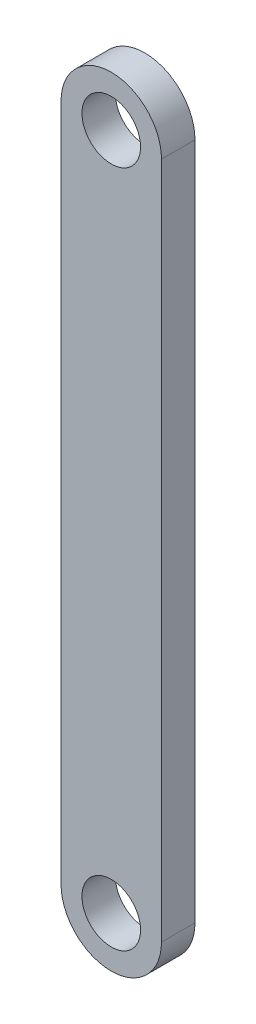
ISO-10303-21;
HEADER;
FILE_DESCRIPTION(('STEP AP214'),'2;1');
FILE_NAME('part.step','',(''),(''),'','','');
FILE_SCHEMA(('AUTOMOTIVE_DESIGN { 1 0 10303 214 1 1 1 1 }'));
ENDSEC;
DATA;
#1=APPLICATION_CONTEXT('core data for automotive mechanical design processes');
#2=APPLICATION_PROTOCOL_DEFINITION('international standard','automotive_design',2000,#1);
#3=PRODUCT_CONTEXT('',#1,'mechanical');
#4=PRODUCT('Part','Part','',(#3));
#5=PRODUCT_RELATED_PRODUCT_CATEGORY('part','',(#4));
#6=PRODUCT_DEFINITION_FORMATION('','',#4);
#7=PRODUCT_DEFINITION_CONTEXT('part definition',#1,'design');
#8=PRODUCT_DEFINITION('design','',#6,#7);
#9=PRODUCT_DEFINITION_SHAPE('','',#8);
#10=(LENGTH_UNIT() NAMED_UNIT(*) SI_UNIT(.MILLI.,.METRE.));
#11=(NAMED_UNIT(*) PLANE_ANGLE_UNIT() SI_UNIT($,.RADIAN.));
#12=(NAMED_UNIT(*) SI_UNIT($,.STERADIAN.) SOLID_ANGLE_UNIT());
#13=UNCERTAINTY_MEASURE_WITH_UNIT(LENGTH_MEASURE(1.E-05),#10,'distance_accuracy_value','');
#14=(GEOMETRIC_REPRESENTATION_CONTEXT(3) GLOBAL_UNCERTAINTY_ASSIGNED_CONTEXT((#13)) GLOBAL_UNIT_ASSIGNED_CONTEXT((#10,
#11,#12)) REPRESENTATION_CONTEXT('',''));
#15=CARTESIAN_POINT('',(0.,0.,0.));
#16=DIRECTION('',(0.,0.,1.));
#17=DIRECTION('',(1.,0.,0.));
#18=AXIS2_PLACEMENT_3D('',#15,#16,#17);
#19=CARTESIAN_POINT('',(0.,0.,12.7));
#20=DIRECTION('',(0.,0.,1.));
#21=DIRECTION('',(1.,0.,0.));
#22=AXIS2_PLACEMENT_3D('',#19,#20,#21);
#23=PLANE('',#22);
#24=CARTESIAN_POINT('',(0.,257.175,12.7));
#25=DIRECTION('',(0.,0.,1.));
#26=DIRECTION('',(1.,0.,0.));
#27=AXIS2_PLACEMENT_3D('',#24,#25,#26);
#28=CIRCLE('',#27,11.1125);
#29=CARTESIAN_POINT('',(11.1125,257.175,12.7));
#30=VERTEX_POINT('',#29);
#31=EDGE_CURVE('E100',#30,#30,#28,.T.);
#32=ORIENTED_EDGE('',*,*,#31,.F.);
#33=EDGE_LOOP('',(#32));
#34=FACE_BOUND('',#33,.T.);
#35=CARTESIAN_POINT('',(0.,0.,12.7));
#36=DIRECTION('',(0.,0.,1.));
#37=DIRECTION('',(1.,0.,0.));
#38=AXIS2_PLACEMENT_3D('',#35,#36,#37);
#39=CIRCLE('',#38,19.05);
#40=CARTESIAN_POINT('',(-19.05,0.,12.7));
#41=VERTEX_POINT('',#40);
#42=CARTESIAN_POINT('',(19.05,0.,12.7));
#43=VERTEX_POINT('',#42);
#44=EDGE_CURVE('E85',#41,#43,#39,.T.);
#45=ORIENTED_EDGE('',*,*,#44,.T.);
#46=DIRECTION('',(0.,1.,0.));
#47=VECTOR('',#46,1.);
#48=CARTESIAN_POINT('',(19.05,0.,12.7));
#49=LINE('',#48,#47);
#50=CARTESIAN_POINT('',(19.05,257.175,12.7));
#51=VERTEX_POINT('',#50);
#52=EDGE_CURVE('E80',#43,#51,#49,.T.);
#53=ORIENTED_EDGE('',*,*,#52,.T.);
#54=CARTESIAN_POINT('',(0.,257.175,12.7));
#55=DIRECTION('',(0.,0.,1.));
#56=DIRECTION('',(1.,0.,0.));
#57=AXIS2_PLACEMENT_3D('',#54,#55,#56);
#58=CIRCLE('',#57,19.05);
#59=CARTESIAN_POINT('',(-19.05,257.175,12.7));
#60=VERTEX_POINT('',#59);
#61=EDGE_CURVE('E83',#51,#60,#58,.T.);
#62=ORIENTED_EDGE('',*,*,#61,.T.);
#63=DIRECTION('',(0.,-1.,0.));
#64=VECTOR('',#63,1.);
#65=CARTESIAN_POINT('',(-19.05,0.,12.7));
#66=LINE('',#65,#64);
#67=EDGE_CURVE('E50',#60,#41,#66,.T.);
#68=ORIENTED_EDGE('',*,*,#67,.T.);
#69=EDGE_LOOP('',(#45,#53,#62,#68));
#70=FACE_BOUND('',#69,.T.);
#71=CARTESIAN_POINT('',(0.,0.,12.7));
#72=DIRECTION('',(0.,0.,1.));
#73=DIRECTION('',(1.,0.,0.));
#74=AXIS2_PLACEMENT_3D('',#71,#72,#73);
#75=CIRCLE('',#74,11.1125);
#76=CARTESIAN_POINT('',(11.1125,0.,12.7));
#77=VERTEX_POINT('',#76);
#78=EDGE_CURVE('E115',#77,#77,#75,.T.);
#79=ORIENTED_EDGE('',*,*,#78,.F.);
#80=EDGE_LOOP('',(#79));
#81=FACE_BOUND('',#80,.T.);
#82=ADVANCED_FACE('F33',(#34,#70,#81),#23,.T.);
#83=CARTESIAN_POINT('',(0.,0.,0.));
#84=DIRECTION('',(0.,0.,1.));
#85=DIRECTION('',(1.,0.,0.));
#86=AXIS2_PLACEMENT_3D('',#83,#84,#85);
#87=PLANE('',#86);
#88=CARTESIAN_POINT('',(0.,0.,0.));
#89=DIRECTION('',(0.,0.,1.));
#90=DIRECTION('',(1.,0.,0.));
#91=AXIS2_PLACEMENT_3D('',#88,#89,#90);
#92=CIRCLE('',#91,19.05);
#93=CARTESIAN_POINT('',(-19.05,0.,0.));
#94=VERTEX_POINT('',#93);
#95=CARTESIAN_POINT('',(19.05,0.,0.));
#96=VERTEX_POINT('',#95);
#97=EDGE_CURVE('E97',#94,#96,#92,.T.);
#98=ORIENTED_EDGE('',*,*,#97,.F.);
#99=DIRECTION('',(0.,-1.,0.));
#100=VECTOR('',#99,1.);
#101=CARTESIAN_POINT('',(-19.05,0.,0.));
#102=LINE('',#101,#100);
#103=CARTESIAN_POINT('',(-19.05,257.175,0.));
#104=VERTEX_POINT('',#103);
#105=EDGE_CURVE('E73',#104,#94,#102,.T.);
#106=ORIENTED_EDGE('',*,*,#105,.F.);
#107=CARTESIAN_POINT('',(0.,257.175,0.));
#108=DIRECTION('',(0.,0.,1.));
#109=DIRECTION('',(1.,0.,0.));
#110=AXIS2_PLACEMENT_3D('',#107,#108,#109);
#111=CIRCLE('',#110,19.05);
#112=CARTESIAN_POINT('',(19.05,257.175,0.));
#113=VERTEX_POINT('',#112);
#114=EDGE_CURVE('E67',#113,#104,#111,.T.);
#115=ORIENTED_EDGE('',*,*,#114,.F.);
#116=DIRECTION('',(0.,1.,0.));
#117=VECTOR('',#116,1.);
#118=CARTESIAN_POINT('',(19.05,0.,0.));
#119=LINE('',#118,#117);
#120=EDGE_CURVE('E89',#96,#113,#119,.T.);
#121=ORIENTED_EDGE('',*,*,#120,.F.);
#122=EDGE_LOOP('',(#98,#106,#115,#121));
#123=FACE_BOUND('',#122,.T.);
#124=CARTESIAN_POINT('',(0.,257.175,0.));
#125=DIRECTION('',(0.,0.,1.));
#126=DIRECTION('',(1.,0.,0.));
#127=AXIS2_PLACEMENT_3D('',#124,#125,#126);
#128=CIRCLE('',#127,11.1125);
#129=CARTESIAN_POINT('',(11.1125,257.175,0.));
#130=VERTEX_POINT('',#129);
#131=EDGE_CURVE('E112',#130,#130,#128,.T.);
#132=ORIENTED_EDGE('',*,*,#131,.T.);
#133=EDGE_LOOP('',(#132));
#134=FACE_BOUND('',#133,.T.);
#135=CARTESIAN_POINT('',(0.,0.,0.));
#136=DIRECTION('',(0.,0.,1.));
#137=DIRECTION('',(1.,0.,0.));
#138=AXIS2_PLACEMENT_3D('',#135,#136,#137);
#139=CIRCLE('',#138,11.1125);
#140=CARTESIAN_POINT('',(11.1125,0.,0.));
#141=VERTEX_POINT('',#140);
#142=EDGE_CURVE('E118',#141,#141,#139,.T.);
#143=ORIENTED_EDGE('',*,*,#142,.T.);
#144=EDGE_LOOP('',(#143));
#145=FACE_BOUND('',#144,.T.);
#146=ADVANCED_FACE('F108',(#123,#134,#145),#87,.F.);
#147=CARTESIAN_POINT('',(0.,0.,12.7));
#148=DIRECTION('',(0.,0.,-1.));
#149=DIRECTION('',(-1.,0.,0.));
#150=AXIS2_PLACEMENT_3D('',#147,#148,#149);
#151=CYLINDRICAL_SURFACE('',#150,19.05);
#152=ORIENTED_EDGE('',*,*,#97,.T.);
#153=DIRECTION('',(0.,0.,-1.));
#154=VECTOR('',#153,1.);
#155=CARTESIAN_POINT('',(19.05,0.,12.7));
#156=LINE('',#155,#154);
#157=EDGE_CURVE('E11',#43,#96,#156,.T.);
#158=ORIENTED_EDGE('',*,*,#157,.F.);
#159=ORIENTED_EDGE('',*,*,#44,.F.);
#160=DIRECTION('',(0.,0.,-1.));
#161=VECTOR('',#160,1.);
#162=CARTESIAN_POINT('',(-19.05,0.,12.7));
#163=LINE('',#162,#161);
#164=EDGE_CURVE('E93',#41,#94,#163,.T.);
#165=ORIENTED_EDGE('',*,*,#164,.T.);
#166=EDGE_LOOP('',(#152,#158,#159,#165));
#167=FACE_BOUND('',#166,.T.);
#168=ADVANCED_FACE('F35',(#167),#151,.T.);
#169=CARTESIAN_POINT('',(19.05,0.,12.7));
#170=DIRECTION('',(-1.,0.,0.));
#171=DIRECTION('',(0.,0.,1.));
#172=AXIS2_PLACEMENT_3D('',#169,#170,#171);
#173=PLANE('',#172);
#174=ORIENTED_EDGE('',*,*,#120,.T.);
#175=DIRECTION('',(0.,0.,-1.));
#176=VECTOR('',#175,1.);
#177=CARTESIAN_POINT('',(19.05,257.175,12.7));
#178=LINE('',#177,#176);
#179=EDGE_CURVE('E42',#51,#113,#178,.T.);
#180=ORIENTED_EDGE('',*,*,#179,.F.);
#181=ORIENTED_EDGE('',*,*,#52,.F.);
#182=ORIENTED_EDGE('',*,*,#157,.T.);
#183=EDGE_LOOP('',(#174,#180,#181,#182));
#184=FACE_BOUND('',#183,.T.);
#185=ADVANCED_FACE('F88',(#184),#173,.F.);
#186=CARTESIAN_POINT('',(0.,257.175,12.7));
#187=DIRECTION('',(0.,0.,-1.));
#188=DIRECTION('',(-1.,0.,0.));
#189=AXIS2_PLACEMENT_3D('',#186,#187,#188);
#190=CYLINDRICAL_SURFACE('',#189,19.05);
#191=ORIENTED_EDGE('',*,*,#114,.T.);
#192=DIRECTION('',(0.,0.,-1.));
#193=VECTOR('',#192,1.);
#194=CARTESIAN_POINT('',(-19.05,257.175,12.7));
#195=LINE('',#194,#193);
#196=EDGE_CURVE('E90',#60,#104,#195,.T.);
#197=ORIENTED_EDGE('',*,*,#196,.F.);
#198=ORIENTED_EDGE('',*,*,#61,.F.);
#199=ORIENTED_EDGE('',*,*,#179,.T.);
#200=EDGE_LOOP('',(#191,#197,#198,#199));
#201=FACE_BOUND('',#200,.T.);
#202=ADVANCED_FACE('F91',(#201),#190,.T.);
#203=CARTESIAN_POINT('',(-19.05,0.,12.7));
#204=DIRECTION('',(1.,0.,0.));
#205=DIRECTION('',(0.,0.,-1.));
#206=AXIS2_PLACEMENT_3D('',#203,#204,#205);
#207=PLANE('',#206);
#208=ORIENTED_EDGE('',*,*,#105,.T.);
#209=ORIENTED_EDGE('',*,*,#164,.F.);
#210=ORIENTED_EDGE('',*,*,#67,.F.);
#211=ORIENTED_EDGE('',*,*,#196,.T.);
#212=EDGE_LOOP('',(#208,#209,#210,#211));
#213=FACE_BOUND('',#212,.T.);
#214=ADVANCED_FACE('F105',(#213),#207,.F.);
#215=CARTESIAN_POINT('',(0.,257.175,12.7));
#216=DIRECTION('',(0.,0.,-1.));
#217=DIRECTION('',(-1.,0.,0.));
#218=AXIS2_PLACEMENT_3D('',#215,#216,#217);
#219=CYLINDRICAL_SURFACE('',#218,11.1125);
#220=ORIENTED_EDGE('',*,*,#31,.T.);
#221=EDGE_LOOP('',(#220));
#222=FACE_BOUND('',#221,.T.);
#223=ORIENTED_EDGE('',*,*,#131,.F.);
#224=EDGE_LOOP('',(#223));
#225=FACE_BOUND('',#224,.T.);
#226=ADVANCED_FACE('F135',(#222,#225),#219,.F.);
#227=CARTESIAN_POINT('',(0.,0.,12.7));
#228=DIRECTION('',(0.,0.,-1.));
#229=DIRECTION('',(-1.,0.,0.));
#230=AXIS2_PLACEMENT_3D('',#227,#228,#229);
#231=CYLINDRICAL_SURFACE('',#230,11.1125);
#232=ORIENTED_EDGE('',*,*,#78,.T.);
#233=EDGE_LOOP('',(#232));
#234=FACE_BOUND('',#233,.T.);
#235=ORIENTED_EDGE('',*,*,#142,.F.);
#236=EDGE_LOOP('',(#235));
#237=FACE_BOUND('',#236,.T.);
#238=ADVANCED_FACE('F124',(#234,#237),#231,.F.);
#239=CLOSED_SHELL('',(#82,#146,#168,#185,#202,#214,#226,#238));
#240=MANIFOLD_SOLID_BREP('B2',#239);
#241=ADVANCED_BREP_SHAPE_REPRESENTATION('',(#18,#240),#14);
#242=SHAPE_DEFINITION_REPRESENTATION(#9,#241);
ENDSEC;
END-ISO-10303-21;
